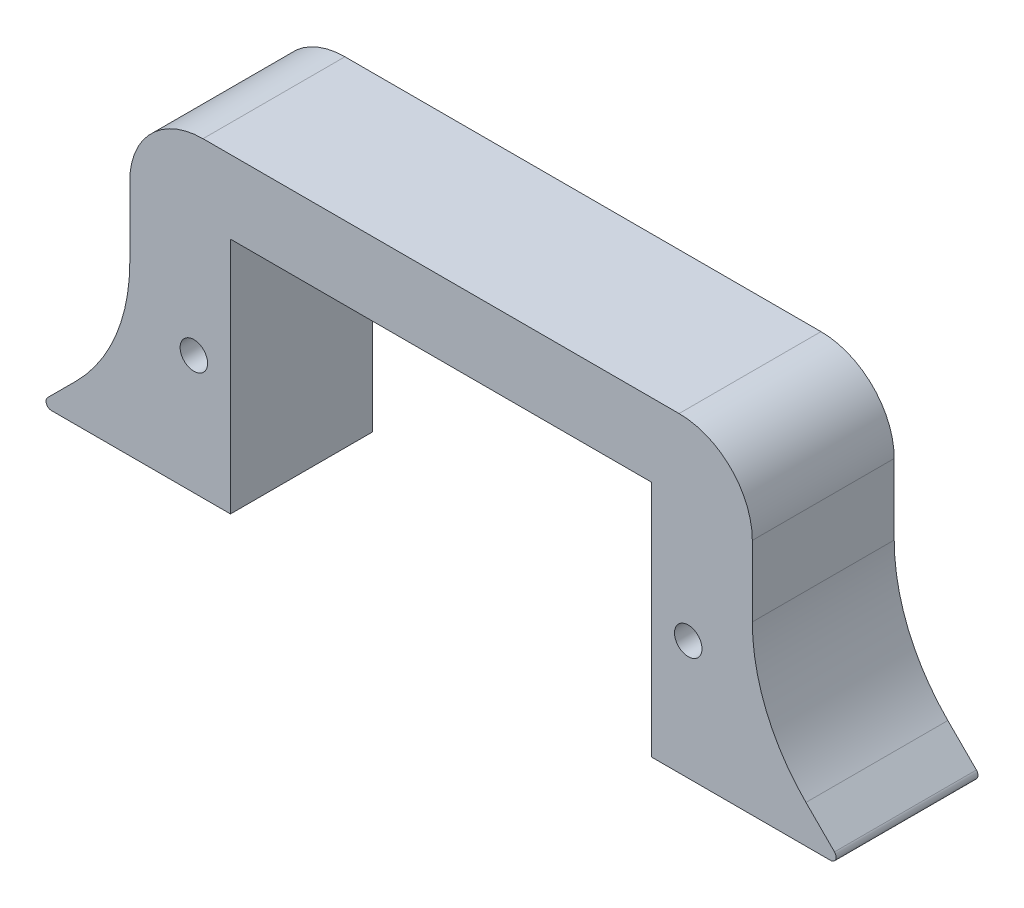
ISO-10303-21;
HEADER;
FILE_DESCRIPTION(('STEP AP214'),'2;1');
FILE_NAME('part.step','',(''),(''),'','','');
FILE_SCHEMA(('AUTOMOTIVE_DESIGN { 1 0 10303 214 1 1 1 1 }'));
ENDSEC;
DATA;
#1=APPLICATION_CONTEXT('core data for automotive mechanical design processes');
#2=APPLICATION_PROTOCOL_DEFINITION('international standard','automotive_design',2000,#1);
#3=PRODUCT_CONTEXT('',#1,'mechanical');
#4=PRODUCT('Part','Part','',(#3));
#5=PRODUCT_RELATED_PRODUCT_CATEGORY('part','',(#4));
#6=PRODUCT_DEFINITION_FORMATION('','',#4);
#7=PRODUCT_DEFINITION_CONTEXT('part definition',#1,'design');
#8=PRODUCT_DEFINITION('design','',#6,#7);
#9=PRODUCT_DEFINITION_SHAPE('','',#8);
#10=(LENGTH_UNIT() NAMED_UNIT(*) SI_UNIT(.MILLI.,.METRE.));
#11=(NAMED_UNIT(*) PLANE_ANGLE_UNIT() SI_UNIT($,.RADIAN.));
#12=(NAMED_UNIT(*) SI_UNIT($,.STERADIAN.) SOLID_ANGLE_UNIT());
#13=UNCERTAINTY_MEASURE_WITH_UNIT(LENGTH_MEASURE(1.E-05),#10,'distance_accuracy_value','');
#14=(GEOMETRIC_REPRESENTATION_CONTEXT(3) GLOBAL_UNCERTAINTY_ASSIGNED_CONTEXT((#13)) GLOBAL_UNIT_ASSIGNED_CONTEXT((#10,
#11,#12)) REPRESENTATION_CONTEXT('',''));
#15=CARTESIAN_POINT('',(0.,0.,0.));
#16=DIRECTION('',(0.,0.,1.));
#17=DIRECTION('',(1.,0.,0.));
#18=AXIS2_PLACEMENT_3D('',#15,#16,#17);
#19=CARTESIAN_POINT('',(0.,-6.5,7.75));
#20=DIRECTION('',(0.,1.,0.));
#21=DIRECTION('',(0.,0.,1.));
#22=AXIS2_PLACEMENT_3D('',#19,#20,#21);
#23=PLANE('',#22);
#24=CARTESIAN_POINT('',(16.75,-6.49999999999999,3.87499999999997));
#25=DIRECTION('',(0.,-1.,0.));
#26=DIRECTION('',(-1.,0.,0.));
#27=AXIS2_PLACEMENT_3D('',#24,#25,#26);
#28=CIRCLE('',#27,0.750000000000003);
#29=CARTESIAN_POINT('',(16.,-6.49999999999999,3.87499999999997));
#30=VERTEX_POINT('',#29);
#31=EDGE_CURVE('E633',#30,#30,#28,.T.);
#32=ORIENTED_EDGE('',*,*,#31,.F.);
#33=EDGE_LOOP('',(#32));
#34=FACE_BOUND('',#33,.T.);
#35=DIRECTION('',(1.,0.,0.));
#36=VECTOR('',#35,1.);
#37=CARTESIAN_POINT('',(0.,-6.5,0.));
#38=LINE('',#37,#36);
#39=CARTESIAN_POINT('',(11.5,-6.5,0.));
#40=VERTEX_POINT('',#39);
#41=CARTESIAN_POINT('',(21.2757359312881,-6.5,0.));
#42=VERTEX_POINT('',#41);
#43=EDGE_CURVE('E194',#40,#42,#38,.T.);
#44=ORIENTED_EDGE('',*,*,#43,.T.);
#45=DIRECTION('',(0.,0.,-1.));
#46=VECTOR('',#45,1.);
#47=CARTESIAN_POINT('',(21.2757359312881,-6.5,7.75));
#48=LINE('',#47,#46);
#49=CARTESIAN_POINT('',(21.2757359312881,-6.5,7.75));
#50=VERTEX_POINT('',#49);
#51=EDGE_CURVE('E295',#42,#50,#48,.F.);
#52=ORIENTED_EDGE('',*,*,#51,.T.);
#53=DIRECTION('',(1.,0.,0.));
#54=VECTOR('',#53,1.);
#55=CARTESIAN_POINT('',(0.,-6.5,7.75));
#56=LINE('',#55,#54);
#57=CARTESIAN_POINT('',(11.5,-6.5,7.75));
#58=VERTEX_POINT('',#57);
#59=EDGE_CURVE('E224',#58,#50,#56,.T.);
#60=ORIENTED_EDGE('',*,*,#59,.F.);
#61=DIRECTION('',(0.,0.,-1.));
#62=VECTOR('',#61,1.);
#63=CARTESIAN_POINT('',(11.5,-6.5,7.75));
#64=LINE('',#63,#62);
#65=EDGE_CURVE('E193',#58,#40,#64,.T.);
#66=ORIENTED_EDGE('',*,*,#65,.T.);
#67=EDGE_LOOP('',(#44,#52,#60,#66));
#68=FACE_BOUND('',#67,.T.);
#69=ADVANCED_FACE('F40',(#34,#68),#23,.F.);
#70=CARTESIAN_POINT('',(17.,0.,7.75));
#71=DIRECTION('',(-1.,0.,0.));
#72=DIRECTION('',(0.,0.,1.));
#73=AXIS2_PLACEMENT_3D('',#70,#71,#72);
#74=PLANE('',#73);
#75=DIRECTION('',(0.,1.,0.));
#76=VECTOR('',#75,1.);
#77=CARTESIAN_POINT('',(17.,0.,0.));
#78=LINE('',#77,#76);
#79=CARTESIAN_POINT('',(17.,2.64213562373093,0.));
#80=VERTEX_POINT('',#79);
#81=CARTESIAN_POINT('',(17.,6.5,0.));
#82=VERTEX_POINT('',#81);
#83=EDGE_CURVE('E198',#80,#82,#78,.T.);
#84=ORIENTED_EDGE('',*,*,#83,.T.);
#85=DIRECTION('',(0.,0.,-1.));
#86=VECTOR('',#85,1.);
#87=CARTESIAN_POINT('',(17.,6.5,7.75));
#88=LINE('',#87,#86);
#89=CARTESIAN_POINT('',(17.,6.5,7.75));
#90=VERTEX_POINT('',#89);
#91=EDGE_CURVE('E282',#82,#90,#88,.F.);
#92=ORIENTED_EDGE('',*,*,#91,.T.);
#93=DIRECTION('',(0.,1.,0.));
#94=VECTOR('',#93,1.);
#95=CARTESIAN_POINT('',(17.,0.,7.75));
#96=LINE('',#95,#94);
#97=CARTESIAN_POINT('',(17.,2.64213562373093,7.75));
#98=VERTEX_POINT('',#97);
#99=EDGE_CURVE('E322',#98,#90,#96,.T.);
#100=ORIENTED_EDGE('',*,*,#99,.F.);
#101=DIRECTION('',(0.,0.,-1.));
#102=VECTOR('',#101,1.);
#103=CARTESIAN_POINT('',(17.,2.64213562373093,0.));
#104=LINE('',#103,#102);
#105=EDGE_CURVE('E165',#98,#80,#104,.T.);
#106=ORIENTED_EDGE('',*,*,#105,.T.);
#107=EDGE_LOOP('',(#84,#92,#100,#106));
#108=FACE_BOUND('',#107,.T.);
#109=ADVANCED_FACE('F345',(#108),#74,.F.);
#110=CARTESIAN_POINT('',(0.,10.5,7.75));
#111=DIRECTION('',(0.,1.,0.));
#112=DIRECTION('',(-1.,0.,0.));
#113=AXIS2_PLACEMENT_3D('',#110,#111,#112);
#114=PLANE('',#113);
#115=DIRECTION('',(1.,0.,0.));
#116=VECTOR('',#115,1.);
#117=CARTESIAN_POINT('',(0.,10.5,0.));
#118=LINE('',#117,#116);
#119=CARTESIAN_POINT('',(-13.,10.5,0.));
#120=VERTEX_POINT('',#119);
#121=CARTESIAN_POINT('',(13.,10.5,0.));
#122=VERTEX_POINT('',#121);
#123=EDGE_CURVE('E203',#120,#122,#118,.T.);
#124=ORIENTED_EDGE('',*,*,#123,.F.);
#125=DIRECTION('',(0.,0.,-1.));
#126=VECTOR('',#125,1.);
#127=CARTESIAN_POINT('',(-13.,10.5,7.75));
#128=LINE('',#127,#126);
#129=CARTESIAN_POINT('',(-13.,10.5,7.75));
#130=VERTEX_POINT('',#129);
#131=EDGE_CURVE('E273',#120,#130,#128,.F.);
#132=ORIENTED_EDGE('',*,*,#131,.T.);
#133=DIRECTION('',(1.,0.,0.));
#134=VECTOR('',#133,1.);
#135=CARTESIAN_POINT('',(0.,10.5,7.75));
#136=LINE('',#135,#134);
#137=CARTESIAN_POINT('',(13.,10.5,7.75));
#138=VERTEX_POINT('',#137);
#139=EDGE_CURVE('E183',#130,#138,#136,.T.);
#140=ORIENTED_EDGE('',*,*,#139,.T.);
#141=DIRECTION('',(0.,0.,-1.));
#142=VECTOR('',#141,1.);
#143=CARTESIAN_POINT('',(13.,10.5,0.));
#144=LINE('',#143,#142);
#145=EDGE_CURVE('E269',#138,#122,#144,.T.);
#146=ORIENTED_EDGE('',*,*,#145,.T.);
#147=EDGE_LOOP('',(#124,#132,#140,#146));
#148=FACE_BOUND('',#147,.T.);
#149=ADVANCED_FACE('F336',(#148),#114,.T.);
#150=CARTESIAN_POINT('',(-17.,0.,7.75));
#151=DIRECTION('',(-1.,0.,0.));
#152=DIRECTION('',(0.,0.,1.));
#153=AXIS2_PLACEMENT_3D('',#150,#151,#152);
#154=PLANE('',#153);
#155=DIRECTION('',(0.,1.,0.));
#156=VECTOR('',#155,1.);
#157=CARTESIAN_POINT('',(-17.,0.,7.75));
#158=LINE('',#157,#156);
#159=CARTESIAN_POINT('',(-17.,2.64213562373095,7.75));
#160=VERTEX_POINT('',#159);
#161=CARTESIAN_POINT('',(-17.,6.5,7.75));
#162=VERTEX_POINT('',#161);
#163=EDGE_CURVE('E179',#160,#162,#158,.T.);
#164=ORIENTED_EDGE('',*,*,#163,.T.);
#165=DIRECTION('',(0.,0.,-1.));
#166=VECTOR('',#165,1.);
#167=CARTESIAN_POINT('',(-17.,6.5,7.75));
#168=LINE('',#167,#166);
#169=CARTESIAN_POINT('',(-17.,6.5,0.));
#170=VERTEX_POINT('',#169);
#171=EDGE_CURVE('E259',#162,#170,#168,.T.);
#172=ORIENTED_EDGE('',*,*,#171,.T.);
#173=DIRECTION('',(0.,1.,0.));
#174=VECTOR('',#173,1.);
#175=CARTESIAN_POINT('',(-17.,0.,0.));
#176=LINE('',#175,#174);
#177=CARTESIAN_POINT('',(-17.,2.64213562373095,0.));
#178=VERTEX_POINT('',#177);
#179=EDGE_CURVE('E207',#178,#170,#176,.T.);
#180=ORIENTED_EDGE('',*,*,#179,.F.);
#181=DIRECTION('',(0.,0.,-1.));
#182=VECTOR('',#181,1.);
#183=CARTESIAN_POINT('',(-17.,2.64213562373095,7.75));
#184=LINE('',#183,#182);
#185=EDGE_CURVE('E243',#178,#160,#184,.F.);
#186=ORIENTED_EDGE('',*,*,#185,.T.);
#187=EDGE_LOOP('',(#164,#172,#180,#186));
#188=FACE_BOUND('',#187,.T.);
#189=ADVANCED_FACE('F542',(#188),#154,.T.);
#190=CARTESIAN_POINT('',(0.,-6.5,7.75));
#191=DIRECTION('',(0.,-1.,0.));
#192=DIRECTION('',(1.,0.,0.));
#193=AXIS2_PLACEMENT_3D('',#190,#191,#192);
#194=PLANE('',#193);
#195=CARTESIAN_POINT('',(-16.75,-6.5,3.875));
#196=DIRECTION('',(0.,-1.,0.));
#197=DIRECTION('',(1.,0.,0.));
#198=AXIS2_PLACEMENT_3D('',#195,#196,#197);
#199=CIRCLE('',#198,0.750000000000002);
#200=CARTESIAN_POINT('',(-16.,-6.5,3.875));
#201=VERTEX_POINT('',#200);
#202=EDGE_CURVE('E363',#201,#201,#199,.T.);
#203=ORIENTED_EDGE('',*,*,#202,.F.);
#204=EDGE_LOOP('',(#203));
#205=FACE_BOUND('',#204,.T.);
#206=DIRECTION('',(-1.,0.,0.));
#207=VECTOR('',#206,1.);
#208=CARTESIAN_POINT('',(0.,-6.5,7.75));
#209=LINE('',#208,#207);
#210=CARTESIAN_POINT('',(-11.5,-6.5,7.75));
#211=VERTEX_POINT('',#210);
#212=CARTESIAN_POINT('',(-21.2757359312881,-6.5,7.75));
#213=VERTEX_POINT('',#212);
#214=EDGE_CURVE('E158',#211,#213,#209,.T.);
#215=ORIENTED_EDGE('',*,*,#214,.T.);
#216=DIRECTION('',(0.,0.,-1.));
#217=VECTOR('',#216,1.);
#218=CARTESIAN_POINT('',(-21.2757359312881,-6.5,0.));
#219=LINE('',#218,#217);
#220=CARTESIAN_POINT('',(-21.2757359312881,-6.5,0.));
#221=VERTEX_POINT('',#220);
#222=EDGE_CURVE('E49',#213,#221,#219,.T.);
#223=ORIENTED_EDGE('',*,*,#222,.T.);
#224=DIRECTION('',(-1.,0.,0.));
#225=VECTOR('',#224,1.);
#226=CARTESIAN_POINT('',(0.,-6.5,0.));
#227=LINE('',#226,#225);
#228=CARTESIAN_POINT('',(-11.5,-6.5,0.));
#229=VERTEX_POINT('',#228);
#230=EDGE_CURVE('E161',#229,#221,#227,.T.);
#231=ORIENTED_EDGE('',*,*,#230,.F.);
#232=DIRECTION('',(0.,0.,-1.));
#233=VECTOR('',#232,1.);
#234=CARTESIAN_POINT('',(-11.5,-6.5,7.75));
#235=LINE('',#234,#233);
#236=EDGE_CURVE('E154',#211,#229,#235,.T.);
#237=ORIENTED_EDGE('',*,*,#236,.F.);
#238=EDGE_LOOP('',(#215,#223,#231,#237));
#239=FACE_BOUND('',#238,.T.);
#240=ADVANCED_FACE('F156',(#205,#239),#194,.T.);
#241=CARTESIAN_POINT('',(-11.5,0.,7.75));
#242=DIRECTION('',(-1.,0.,0.));
#243=DIRECTION('',(0.,0.,1.));
#244=AXIS2_PLACEMENT_3D('',#241,#242,#243);
#245=PLANE('',#244);
#246=DIRECTION('',(0.,1.,0.));
#247=VECTOR('',#246,1.);
#248=CARTESIAN_POINT('',(-11.5,0.,0.));
#249=LINE('',#248,#247);
#250=CARTESIAN_POINT('',(-11.5,6.5,0.));
#251=VERTEX_POINT('',#250);
#252=EDGE_CURVE('E213',#229,#251,#249,.T.);
#253=ORIENTED_EDGE('',*,*,#252,.T.);
#254=DIRECTION('',(0.,0.,-1.));
#255=VECTOR('',#254,1.);
#256=CARTESIAN_POINT('',(-11.5,6.5,7.75));
#257=LINE('',#256,#255);
#258=CARTESIAN_POINT('',(-11.5,6.5,7.75));
#259=VERTEX_POINT('',#258);
#260=EDGE_CURVE('E166',#259,#251,#257,.T.);
#261=ORIENTED_EDGE('',*,*,#260,.F.);
#262=DIRECTION('',(0.,1.,0.));
#263=VECTOR('',#262,1.);
#264=CARTESIAN_POINT('',(-11.5,0.,7.75));
#265=LINE('',#264,#263);
#266=EDGE_CURVE('E169',#211,#259,#265,.T.);
#267=ORIENTED_EDGE('',*,*,#266,.F.);
#268=ORIENTED_EDGE('',*,*,#236,.T.);
#269=EDGE_LOOP('',(#253,#261,#267,#268));
#270=FACE_BOUND('',#269,.T.);
#271=ADVANCED_FACE('F170',(#270),#245,.F.);
#272=CARTESIAN_POINT('',(0.,6.5,7.75));
#273=DIRECTION('',(0.,1.,0.));
#274=DIRECTION('',(0.,0.,1.));
#275=AXIS2_PLACEMENT_3D('',#272,#273,#274);
#276=PLANE('',#275);
#277=DIRECTION('',(1.,0.,0.));
#278=VECTOR('',#277,1.);
#279=CARTESIAN_POINT('',(0.,6.5,0.));
#280=LINE('',#279,#278);
#281=CARTESIAN_POINT('',(11.5,6.5,0.));
#282=VERTEX_POINT('',#281);
#283=EDGE_CURVE('E216',#251,#282,#280,.T.);
#284=ORIENTED_EDGE('',*,*,#283,.T.);
#285=DIRECTION('',(0.,0.,-1.));
#286=VECTOR('',#285,1.);
#287=CARTESIAN_POINT('',(11.5,6.5,7.75));
#288=LINE('',#287,#286);
#289=CARTESIAN_POINT('',(11.5,6.5,7.75));
#290=VERTEX_POINT('',#289);
#291=EDGE_CURVE('E227',#290,#282,#288,.T.);
#292=ORIENTED_EDGE('',*,*,#291,.F.);
#293=DIRECTION('',(1.,0.,0.));
#294=VECTOR('',#293,1.);
#295=CARTESIAN_POINT('',(0.,6.5,7.75));
#296=LINE('',#295,#294);
#297=EDGE_CURVE('E174',#259,#290,#296,.T.);
#298=ORIENTED_EDGE('',*,*,#297,.F.);
#299=ORIENTED_EDGE('',*,*,#260,.T.);
#300=EDGE_LOOP('',(#284,#292,#298,#299));
#301=FACE_BOUND('',#300,.T.);
#302=ADVANCED_FACE('F310',(#301),#276,.F.);
#303=CARTESIAN_POINT('',(11.5,0.,7.75));
#304=DIRECTION('',(-1.,0.,0.));
#305=DIRECTION('',(0.,0.,1.));
#306=AXIS2_PLACEMENT_3D('',#303,#304,#305);
#307=PLANE('',#306);
#308=DIRECTION('',(0.,1.,0.));
#309=VECTOR('',#308,1.);
#310=CARTESIAN_POINT('',(11.5,0.,0.));
#311=LINE('',#310,#309);
#312=EDGE_CURVE('E220',#40,#282,#311,.T.);
#313=ORIENTED_EDGE('',*,*,#312,.F.);
#314=ORIENTED_EDGE('',*,*,#65,.F.);
#315=DIRECTION('',(0.,1.,0.));
#316=VECTOR('',#315,1.);
#317=CARTESIAN_POINT('',(11.5,0.,7.75));
#318=LINE('',#317,#316);
#319=EDGE_CURVE('E189',#58,#290,#318,.T.);
#320=ORIENTED_EDGE('',*,*,#319,.T.);
#321=ORIENTED_EDGE('',*,*,#291,.T.);
#322=EDGE_LOOP('',(#313,#314,#320,#321));
#323=FACE_BOUND('',#322,.T.);
#324=ADVANCED_FACE('F317',(#323),#307,.T.);
#325=CARTESIAN_POINT('',(0.,0.,7.75));
#326=DIRECTION('',(0.,0.,1.));
#327=DIRECTION('',(1.,0.,0.));
#328=AXIS2_PLACEMENT_3D('',#325,#326,#327);
#329=PLANE('',#328);
#330=CARTESIAN_POINT('',(-13.5,0.,7.75));
#331=DIRECTION('',(0.,0.,1.));
#332=DIRECTION('',(1.,0.,0.));
#333=AXIS2_PLACEMENT_3D('',#330,#331,#332);
#334=CIRCLE('',#333,0.75);
#335=CARTESIAN_POINT('',(-12.75,0.,7.75));
#336=VERTEX_POINT('',#335);
#337=EDGE_CURVE('E375',#336,#336,#334,.T.);
#338=ORIENTED_EDGE('',*,*,#337,.F.);
#339=EDGE_LOOP('',(#338));
#340=FACE_BOUND('',#339,.T.);
#341=CARTESIAN_POINT('',(13.5,0.,7.75));
#342=DIRECTION('',(0.,0.,1.));
#343=DIRECTION('',(-1.,0.,0.));
#344=AXIS2_PLACEMENT_3D('',#341,#342,#343);
#345=CIRCLE('',#344,0.75);
#346=CARTESIAN_POINT('',(12.75,0.,7.75));
#347=VERTEX_POINT('',#346);
#348=EDGE_CURVE('E328',#347,#347,#345,.T.);
#349=ORIENTED_EDGE('',*,*,#348,.F.);
#350=EDGE_LOOP('',(#349));
#351=FACE_BOUND('',#350,.T.);
#352=ORIENTED_EDGE('',*,*,#59,.T.);
#353=CARTESIAN_POINT('',(21.2757359312881,-6.2,7.75));
#354=DIRECTION('',(0.,0.,1.));
#355=DIRECTION('',(1.,0.,0.));
#356=AXIS2_PLACEMENT_3D('',#353,#354,#355);
#357=CIRCLE('',#356,0.3);
#358=CARTESIAN_POINT('',(21.487867965644,-5.98786796564404,7.75));
#359=VERTEX_POINT('',#358);
#360=EDGE_CURVE('E300',#50,#359,#357,.T.);
#361=ORIENTED_EDGE('',*,*,#360,.T.);
#362=DIRECTION('',(-0.707106781186547,0.707106781186548,0.));
#363=VECTOR('',#362,1.);
#364=CARTESIAN_POINT('',(17.,-1.50000000000001,7.75));
#365=LINE('',#364,#363);
#366=CARTESIAN_POINT('',(19.9289321881345,-4.42893218813454,7.75));
#367=VERTEX_POINT('',#366);
#368=EDGE_CURVE('E355',#359,#367,#365,.T.);
#369=ORIENTED_EDGE('',*,*,#368,.T.);
#370=CARTESIAN_POINT('',(27.,2.64213562373093,7.75));
#371=DIRECTION('',(0.,0.,1.));
#372=DIRECTION('',(1.,0.,0.));
#373=AXIS2_PLACEMENT_3D('',#370,#371,#372);
#374=CIRCLE('',#373,10.);
#375=EDGE_CURVE('E250',#367,#98,#374,.F.);
#376=ORIENTED_EDGE('',*,*,#375,.T.);
#377=ORIENTED_EDGE('',*,*,#99,.T.);
#378=CARTESIAN_POINT('',(13.,6.5,7.75));
#379=DIRECTION('',(0.,0.,1.));
#380=DIRECTION('',(1.,0.,0.));
#381=AXIS2_PLACEMENT_3D('',#378,#379,#380);
#382=CIRCLE('',#381,4.);
#383=EDGE_CURVE('E276',#90,#138,#382,.T.);
#384=ORIENTED_EDGE('',*,*,#383,.T.);
#385=ORIENTED_EDGE('',*,*,#139,.F.);
#386=CARTESIAN_POINT('',(-13.,6.5,7.75));
#387=DIRECTION('',(0.,0.,1.));
#388=DIRECTION('',(1.,0.,0.));
#389=AXIS2_PLACEMENT_3D('',#386,#387,#388);
#390=CIRCLE('',#389,4.);
#391=EDGE_CURVE('E279',#130,#162,#390,.T.);
#392=ORIENTED_EDGE('',*,*,#391,.T.);
#393=ORIENTED_EDGE('',*,*,#163,.F.);
#394=CARTESIAN_POINT('',(-27.,2.64213562373095,7.75));
#395=DIRECTION('',(0.,0.,1.));
#396=DIRECTION('',(1.,0.,0.));
#397=AXIS2_PLACEMENT_3D('',#394,#395,#396);
#398=CIRCLE('',#397,10.);
#399=CARTESIAN_POINT('',(-19.9289321881345,-4.42893218813453,7.75));
#400=VERTEX_POINT('',#399);
#401=EDGE_CURVE('E256',#160,#400,#398,.F.);
#402=ORIENTED_EDGE('',*,*,#401,.T.);
#403=DIRECTION('',(-0.707106781186548,-0.707106781186547,0.));
#404=VECTOR('',#403,1.);
#405=CARTESIAN_POINT('',(-17.,-1.5,7.75));
#406=LINE('',#405,#404);
#407=CARTESIAN_POINT('',(-21.487867965644,-5.98786796564404,7.75));
#408=VERTEX_POINT('',#407);
#409=EDGE_CURVE('E367',#400,#408,#406,.T.);
#410=ORIENTED_EDGE('',*,*,#409,.T.);
#411=CARTESIAN_POINT('',(-21.2757359312881,-6.2,7.75));
#412=DIRECTION('',(0.,0.,1.));
#413=DIRECTION('',(1.,0.,0.));
#414=AXIS2_PLACEMENT_3D('',#411,#412,#413);
#415=CIRCLE('',#414,0.3);
#416=EDGE_CURVE('E56',#408,#213,#415,.T.);
#417=ORIENTED_EDGE('',*,*,#416,.T.);
#418=ORIENTED_EDGE('',*,*,#214,.F.);
#419=ORIENTED_EDGE('',*,*,#266,.T.);
#420=ORIENTED_EDGE('',*,*,#297,.T.);
#421=ORIENTED_EDGE('',*,*,#319,.F.);
#422=EDGE_LOOP('',(#352,#361,#369,#376,#377,#384,#385,#392,#393,#402,#410,#417,#418,#419,#420,#421));
#423=FACE_BOUND('',#422,.T.);
#424=ADVANCED_FACE('F177',(#340,#351,#423),#329,.T.);
#425=CARTESIAN_POINT('',(0.,0.,0.));
#426=DIRECTION('',(0.,0.,1.));
#427=DIRECTION('',(1.,0.,0.));
#428=AXIS2_PLACEMENT_3D('',#425,#426,#427);
#429=PLANE('',#428);
#430=CARTESIAN_POINT('',(-13.5,0.,0.));
#431=DIRECTION('',(0.,0.,1.));
#432=DIRECTION('',(1.,0.,0.));
#433=AXIS2_PLACEMENT_3D('',#430,#431,#432);
#434=CIRCLE('',#433,0.75);
#435=CARTESIAN_POINT('',(-12.75,0.,0.));
#436=VERTEX_POINT('',#435);
#437=EDGE_CURVE('E199',#436,#436,#434,.T.);
#438=ORIENTED_EDGE('',*,*,#437,.T.);
#439=EDGE_LOOP('',(#438));
#440=FACE_BOUND('',#439,.T.);
#441=CARTESIAN_POINT('',(13.5,0.,0.));
#442=DIRECTION('',(0.,0.,1.));
#443=DIRECTION('',(-1.,0.,0.));
#444=AXIS2_PLACEMENT_3D('',#441,#442,#443);
#445=CIRCLE('',#444,0.75);
#446=CARTESIAN_POINT('',(12.75,0.,0.));
#447=VERTEX_POINT('',#446);
#448=EDGE_CURVE('E378',#447,#447,#445,.T.);
#449=ORIENTED_EDGE('',*,*,#448,.T.);
#450=EDGE_LOOP('',(#449));
#451=FACE_BOUND('',#450,.T.);
#452=DIRECTION('',(-0.707106781186547,0.707106781186548,0.));
#453=VECTOR('',#452,1.);
#454=CARTESIAN_POINT('',(17.,-1.50000000000001,0.));
#455=LINE('',#454,#453);
#456=CARTESIAN_POINT('',(21.487867965644,-5.98786796564404,0.));
#457=VERTEX_POINT('',#456);
#458=CARTESIAN_POINT('',(19.9289321881345,-4.42893218813454,0.));
#459=VERTEX_POINT('',#458);
#460=EDGE_CURVE('E352',#457,#459,#455,.T.);
#461=ORIENTED_EDGE('',*,*,#460,.F.);
#462=CARTESIAN_POINT('',(21.2757359312881,-6.2,0.));
#463=DIRECTION('',(0.,0.,1.));
#464=DIRECTION('',(1.,0.,0.));
#465=AXIS2_PLACEMENT_3D('',#462,#463,#464);
#466=CIRCLE('',#465,0.3);
#467=EDGE_CURVE('E292',#457,#42,#466,.F.);
#468=ORIENTED_EDGE('',*,*,#467,.T.);
#469=ORIENTED_EDGE('',*,*,#43,.F.);
#470=ORIENTED_EDGE('',*,*,#312,.T.);
#471=ORIENTED_EDGE('',*,*,#283,.F.);
#472=ORIENTED_EDGE('',*,*,#252,.F.);
#473=ORIENTED_EDGE('',*,*,#230,.T.);
#474=CARTESIAN_POINT('',(-21.2757359312881,-6.2,0.));
#475=DIRECTION('',(0.,0.,1.));
#476=DIRECTION('',(1.,0.,0.));
#477=AXIS2_PLACEMENT_3D('',#474,#475,#476);
#478=CIRCLE('',#477,0.3);
#479=CARTESIAN_POINT('',(-21.487867965644,-5.98786796564404,0.));
#480=VERTEX_POINT('',#479);
#481=EDGE_CURVE('E289',#221,#480,#478,.F.);
#482=ORIENTED_EDGE('',*,*,#481,.T.);
#483=DIRECTION('',(-0.707106781186548,-0.707106781186547,0.));
#484=VECTOR('',#483,1.);
#485=CARTESIAN_POINT('',(-17.,-1.5,0.));
#486=LINE('',#485,#484);
#487=CARTESIAN_POINT('',(-19.9289321881345,-4.42893218813453,0.));
#488=VERTEX_POINT('',#487);
#489=EDGE_CURVE('E360',#488,#480,#486,.T.);
#490=ORIENTED_EDGE('',*,*,#489,.F.);
#491=CARTESIAN_POINT('',(-27.,2.64213562373095,0.));
#492=DIRECTION('',(0.,0.,1.));
#493=DIRECTION('',(1.,0.,0.));
#494=AXIS2_PLACEMENT_3D('',#491,#492,#493);
#495=CIRCLE('',#494,10.);
#496=EDGE_CURVE('E253',#488,#178,#495,.T.);
#497=ORIENTED_EDGE('',*,*,#496,.T.);
#498=ORIENTED_EDGE('',*,*,#179,.T.);
#499=CARTESIAN_POINT('',(-13.,6.5,0.));
#500=DIRECTION('',(0.,0.,1.));
#501=DIRECTION('',(1.,0.,0.));
#502=AXIS2_PLACEMENT_3D('',#499,#500,#501);
#503=CIRCLE('',#502,4.);
#504=EDGE_CURVE('E266',#170,#120,#503,.F.);
#505=ORIENTED_EDGE('',*,*,#504,.T.);
#506=ORIENTED_EDGE('',*,*,#123,.T.);
#507=CARTESIAN_POINT('',(13.,6.5,0.));
#508=DIRECTION('',(0.,0.,1.));
#509=DIRECTION('',(1.,0.,0.));
#510=AXIS2_PLACEMENT_3D('',#507,#508,#509);
#511=CIRCLE('',#510,4.);
#512=EDGE_CURVE('E263',#122,#82,#511,.F.);
#513=ORIENTED_EDGE('',*,*,#512,.T.);
#514=ORIENTED_EDGE('',*,*,#83,.F.);
#515=CARTESIAN_POINT('',(27.,2.64213562373093,0.));
#516=DIRECTION('',(0.,0.,1.));
#517=DIRECTION('',(1.,0.,0.));
#518=AXIS2_PLACEMENT_3D('',#515,#516,#517);
#519=CIRCLE('',#518,10.);
#520=EDGE_CURVE('E246',#80,#459,#519,.T.);
#521=ORIENTED_EDGE('',*,*,#520,.T.);
#522=EDGE_LOOP('',(#461,#468,#469,#470,#471,#472,#473,#482,#490,#497,#498,#505,#506,#513,#514,#521));
#523=FACE_BOUND('',#522,.T.);
#524=ADVANCED_FACE('F306',(#440,#451,#523),#429,.F.);
#525=CARTESIAN_POINT('',(13.5,0.,0.));
#526=DIRECTION('',(0.,0.,1.));
#527=DIRECTION('',(1.,0.,0.));
#528=AXIS2_PLACEMENT_3D('',#525,#526,#527);
#529=CYLINDRICAL_SURFACE('',#528,0.75);
#530=ORIENTED_EDGE('',*,*,#448,.F.);
#531=EDGE_LOOP('',(#530));
#532=FACE_BOUND('',#531,.T.);
#533=ORIENTED_EDGE('',*,*,#348,.T.);
#534=EDGE_LOOP('',(#533));
#535=FACE_BOUND('',#534,.T.);
#536=ADVANCED_FACE('F387',(#532,#535),#529,.F.);
#537=CARTESIAN_POINT('',(-13.5,0.,0.));
#538=DIRECTION('',(0.,0.,1.));
#539=DIRECTION('',(1.,0.,0.));
#540=AXIS2_PLACEMENT_3D('',#537,#538,#539);
#541=CYLINDRICAL_SURFACE('',#540,0.75);
#542=ORIENTED_EDGE('',*,*,#437,.F.);
#543=EDGE_LOOP('',(#542));
#544=FACE_BOUND('',#543,.T.);
#545=ORIENTED_EDGE('',*,*,#337,.T.);
#546=EDGE_LOOP('',(#545));
#547=FACE_BOUND('',#546,.T.);
#548=ADVANCED_FACE('F445',(#544,#547),#541,.F.);
#549=CARTESIAN_POINT('',(-17.,-1.5,7.75));
#550=DIRECTION('',(0.707106781186547,-0.707106781186548,0.));
#551=DIRECTION('',(0.707106781186548,0.707106781186547,0.));
#552=AXIS2_PLACEMENT_3D('',#549,#550,#551);
#553=PLANE('',#552);
#554=ORIENTED_EDGE('',*,*,#489,.T.);
#555=DIRECTION('',(0.,0.,-1.));
#556=VECTOR('',#555,1.);
#557=CARTESIAN_POINT('',(-21.487867965644,-5.98786796564404,7.75));
#558=LINE('',#557,#556);
#559=EDGE_CURVE('E11',#480,#408,#558,.F.);
#560=ORIENTED_EDGE('',*,*,#559,.T.);
#561=ORIENTED_EDGE('',*,*,#409,.F.);
#562=DIRECTION('',(0.,0.,-1.));
#563=VECTOR('',#562,1.);
#564=CARTESIAN_POINT('',(-19.9289321881345,-4.42893218813453,7.75));
#565=LINE('',#564,#563);
#566=EDGE_CURVE('E239',#400,#488,#565,.T.);
#567=ORIENTED_EDGE('',*,*,#566,.T.);
#568=EDGE_LOOP('',(#554,#560,#561,#567));
#569=FACE_BOUND('',#568,.T.);
#570=ADVANCED_FACE('F436',(#569),#553,.F.);
#571=CARTESIAN_POINT('',(17.,-1.50000000000001,7.75));
#572=DIRECTION('',(-0.707106781186548,-0.707106781186547,0.));
#573=DIRECTION('',(0.707106781186547,-0.707106781186548,0.));
#574=AXIS2_PLACEMENT_3D('',#571,#572,#573);
#575=PLANE('',#574);
#576=ORIENTED_EDGE('',*,*,#368,.F.);
#577=DIRECTION('',(0.,0.,-1.));
#578=VECTOR('',#577,1.);
#579=CARTESIAN_POINT('',(21.487867965644,-5.98786796564404,7.75));
#580=LINE('',#579,#578);
#581=EDGE_CURVE('E285',#359,#457,#580,.T.);
#582=ORIENTED_EDGE('',*,*,#581,.T.);
#583=ORIENTED_EDGE('',*,*,#460,.T.);
#584=DIRECTION('',(0.,0.,-1.));
#585=VECTOR('',#584,1.);
#586=CARTESIAN_POINT('',(19.9289321881345,-4.42893218813454,7.75));
#587=LINE('',#586,#585);
#588=EDGE_CURVE('E235',#459,#367,#587,.F.);
#589=ORIENTED_EDGE('',*,*,#588,.T.);
#590=EDGE_LOOP('',(#576,#582,#583,#589));
#591=FACE_BOUND('',#590,.T.);
#592=ADVANCED_FACE('F433',(#591),#575,.F.);
#593=CARTESIAN_POINT('',(-16.75,-4.5,3.875));
#594=DIRECTION('',(0.,-1.,0.));
#595=DIRECTION('',(1.,0.,0.));
#596=AXIS2_PLACEMENT_3D('',#593,#594,#595);
#597=CYLINDRICAL_SURFACE('',#596,0.750000000000002);
#598=CARTESIAN_POINT('',(-16.75,-4.5,3.875));
#599=DIRECTION('',(0.,-1.,0.));
#600=DIRECTION('',(1.,0.,0.));
#601=AXIS2_PLACEMENT_3D('',#598,#599,#600);
#602=CIRCLE('',#601,0.750000000000002);
#603=CARTESIAN_POINT('',(-16.,-4.5,3.875));
#604=VERTEX_POINT('',#603);
#605=EDGE_CURVE('E356',#604,#604,#602,.T.);
#606=ORIENTED_EDGE('',*,*,#605,.F.);
#607=EDGE_LOOP('',(#606));
#608=FACE_BOUND('',#607,.T.);
#609=ORIENTED_EDGE('',*,*,#202,.T.);
#610=EDGE_LOOP('',(#609));
#611=FACE_BOUND('',#610,.T.);
#612=ADVANCED_FACE('F435',(#608,#611),#597,.F.);
#613=CARTESIAN_POINT('',(-16.75,-4.5,3.875));
#614=DIRECTION('',(0.,-1.,0.));
#615=DIRECTION('',(1.,0.,0.));
#616=AXIS2_PLACEMENT_3D('',#613,#614,#615);
#617=PLANE('',#616);
#618=ORIENTED_EDGE('',*,*,#605,.T.);
#619=EDGE_LOOP('',(#618));
#620=FACE_BOUND('',#619,.T.);
#621=ADVANCED_FACE('F442',(#620),#617,.T.);
#622=CARTESIAN_POINT('',(16.75,-4.49999999999999,3.87499999999997));
#623=DIRECTION('',(0.,-1.,0.));
#624=DIRECTION('',(1.,0.,0.));
#625=AXIS2_PLACEMENT_3D('',#622,#623,#624);
#626=CYLINDRICAL_SURFACE('',#625,0.750000000000003);
#627=CARTESIAN_POINT('',(16.75,-4.49999999999999,3.87499999999997));
#628=DIRECTION('',(0.,-1.,0.));
#629=DIRECTION('',(-1.,0.,0.));
#630=AXIS2_PLACEMENT_3D('',#627,#628,#629);
#631=CIRCLE('',#630,0.750000000000003);
#632=CARTESIAN_POINT('',(16.,-4.49999999999999,3.87499999999997));
#633=VERTEX_POINT('',#632);
#634=EDGE_CURVE('E629',#633,#633,#631,.T.);
#635=ORIENTED_EDGE('',*,*,#634,.F.);
#636=EDGE_LOOP('',(#635));
#637=FACE_BOUND('',#636,.T.);
#638=ORIENTED_EDGE('',*,*,#31,.T.);
#639=EDGE_LOOP('',(#638));
#640=FACE_BOUND('',#639,.T.);
#641=ADVANCED_FACE('F448',(#637,#640),#626,.F.);
#642=CARTESIAN_POINT('',(16.75,-4.49999999999999,3.87499999999997));
#643=DIRECTION('',(0.,1.,0.));
#644=DIRECTION('',(-1.,0.,0.));
#645=AXIS2_PLACEMENT_3D('',#642,#643,#644);
#646=PLANE('',#645);
#647=ORIENTED_EDGE('',*,*,#634,.T.);
#648=EDGE_LOOP('',(#647));
#649=FACE_BOUND('',#648,.T.);
#650=ADVANCED_FACE('F416',(#649),#646,.F.);
#651=CARTESIAN_POINT('',(27.,2.64213562373093,7.75));
#652=DIRECTION('',(0.,0.,1.));
#653=DIRECTION('',(1.,0.,0.));
#654=AXIS2_PLACEMENT_3D('',#651,#652,#653);
#655=CYLINDRICAL_SURFACE('',#654,10.);
#656=ORIENTED_EDGE('',*,*,#375,.F.);
#657=ORIENTED_EDGE('',*,*,#588,.F.);
#658=ORIENTED_EDGE('',*,*,#520,.F.);
#659=ORIENTED_EDGE('',*,*,#105,.F.);
#660=EDGE_LOOP('',(#656,#657,#658,#659));
#661=FACE_BOUND('',#660,.T.);
#662=ADVANCED_FACE('F350',(#661),#655,.F.);
#663=CARTESIAN_POINT('',(-27.,2.64213562373095,7.75));
#664=DIRECTION('',(0.,0.,-1.));
#665=DIRECTION('',(-1.,0.,0.));
#666=AXIS2_PLACEMENT_3D('',#663,#664,#665);
#667=CYLINDRICAL_SURFACE('',#666,10.);
#668=ORIENTED_EDGE('',*,*,#401,.F.);
#669=ORIENTED_EDGE('',*,*,#185,.F.);
#670=ORIENTED_EDGE('',*,*,#496,.F.);
#671=ORIENTED_EDGE('',*,*,#566,.F.);
#672=EDGE_LOOP('',(#668,#669,#670,#671));
#673=FACE_BOUND('',#672,.T.);
#674=ADVANCED_FACE('F415',(#673),#667,.F.);
#675=CARTESIAN_POINT('',(-13.,6.5,7.75));
#676=DIRECTION('',(0.,0.,-1.));
#677=DIRECTION('',(-1.,0.,0.));
#678=AXIS2_PLACEMENT_3D('',#675,#676,#677);
#679=CYLINDRICAL_SURFACE('',#678,4.);
#680=ORIENTED_EDGE('',*,*,#391,.F.);
#681=ORIENTED_EDGE('',*,*,#131,.F.);
#682=ORIENTED_EDGE('',*,*,#504,.F.);
#683=ORIENTED_EDGE('',*,*,#171,.F.);
#684=EDGE_LOOP('',(#680,#681,#682,#683));
#685=FACE_BOUND('',#684,.T.);
#686=ADVANCED_FACE('F419',(#685),#679,.T.);
#687=CARTESIAN_POINT('',(13.,6.5,7.75));
#688=DIRECTION('',(0.,0.,1.));
#689=DIRECTION('',(1.,0.,0.));
#690=AXIS2_PLACEMENT_3D('',#687,#688,#689);
#691=CYLINDRICAL_SURFACE('',#690,4.);
#692=ORIENTED_EDGE('',*,*,#383,.F.);
#693=ORIENTED_EDGE('',*,*,#91,.F.);
#694=ORIENTED_EDGE('',*,*,#512,.F.);
#695=ORIENTED_EDGE('',*,*,#145,.F.);
#696=EDGE_LOOP('',(#692,#693,#694,#695));
#697=FACE_BOUND('',#696,.T.);
#698=ADVANCED_FACE('F341',(#697),#691,.T.);
#699=CARTESIAN_POINT('',(21.2757359312881,-6.2,7.75));
#700=DIRECTION('',(0.,0.,-1.));
#701=DIRECTION('',(-1.,0.,0.));
#702=AXIS2_PLACEMENT_3D('',#699,#700,#701);
#703=CYLINDRICAL_SURFACE('',#702,0.3);
#704=ORIENTED_EDGE('',*,*,#360,.F.);
#705=ORIENTED_EDGE('',*,*,#51,.F.);
#706=ORIENTED_EDGE('',*,*,#467,.F.);
#707=ORIENTED_EDGE('',*,*,#581,.F.);
#708=EDGE_LOOP('',(#704,#705,#706,#707));
#709=FACE_BOUND('',#708,.T.);
#710=ADVANCED_FACE('F425',(#709),#703,.T.);
#711=CARTESIAN_POINT('',(-21.2757359312881,-6.2,7.75));
#712=DIRECTION('',(0.,0.,1.));
#713=DIRECTION('',(1.,0.,0.));
#714=AXIS2_PLACEMENT_3D('',#711,#712,#713);
#715=CYLINDRICAL_SURFACE('',#714,0.3);
#716=ORIENTED_EDGE('',*,*,#416,.F.);
#717=ORIENTED_EDGE('',*,*,#559,.F.);
#718=ORIENTED_EDGE('',*,*,#481,.F.);
#719=ORIENTED_EDGE('',*,*,#222,.F.);
#720=EDGE_LOOP('',(#716,#717,#718,#719));
#721=FACE_BOUND('',#720,.T.);
#722=ADVANCED_FACE('F42',(#721),#715,.T.);
#723=CLOSED_SHELL('',(#69,#109,#149,#189,#240,#271,#302,#324,#424,#524,#536,#548,#570,#592,#612,
#621,#641,#650,#662,#674,#686,#698,#710,#722));
#724=MANIFOLD_SOLID_BREP('B2',#723);
#725=ADVANCED_BREP_SHAPE_REPRESENTATION('',(#18,#724),#14);
#726=SHAPE_DEFINITION_REPRESENTATION(#9,#725);
ENDSEC;
END-ISO-10303-21;
